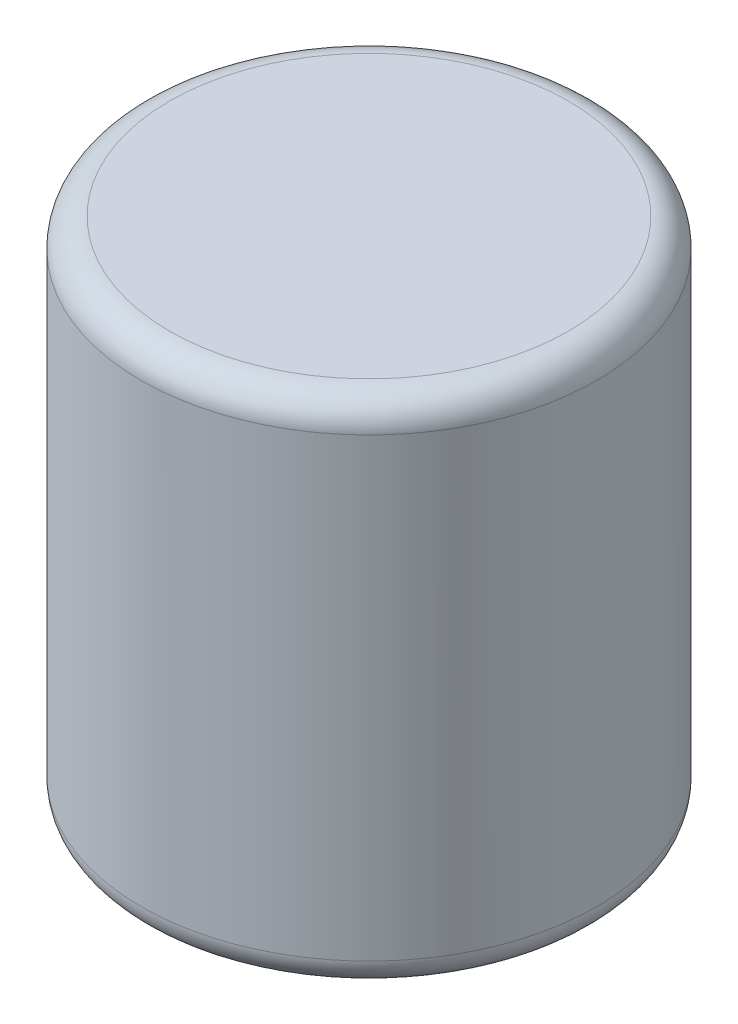
ISO-10303-21;
HEADER;
FILE_DESCRIPTION(('STEP AP214'),'2;1');
FILE_NAME('part.step','',(''),(''),'','','');
FILE_SCHEMA(('AUTOMOTIVE_DESIGN { 1 0 10303 214 1 1 1 1 }'));
ENDSEC;
DATA;
#1=APPLICATION_CONTEXT('core data for automotive mechanical design processes');
#2=APPLICATION_PROTOCOL_DEFINITION('international standard','automotive_design',2000,#1);
#3=PRODUCT_CONTEXT('',#1,'mechanical');
#4=PRODUCT('Part','Part','',(#3));
#5=PRODUCT_RELATED_PRODUCT_CATEGORY('part','',(#4));
#6=PRODUCT_DEFINITION_FORMATION('','',#4);
#7=PRODUCT_DEFINITION_CONTEXT('part definition',#1,'design');
#8=PRODUCT_DEFINITION('design','',#6,#7);
#9=PRODUCT_DEFINITION_SHAPE('','',#8);
#10=(LENGTH_UNIT() NAMED_UNIT(*) SI_UNIT(.MILLI.,.METRE.));
#11=(NAMED_UNIT(*) PLANE_ANGLE_UNIT() SI_UNIT($,.RADIAN.));
#12=(NAMED_UNIT(*) SI_UNIT($,.STERADIAN.) SOLID_ANGLE_UNIT());
#13=UNCERTAINTY_MEASURE_WITH_UNIT(LENGTH_MEASURE(1.E-05),#10,'distance_accuracy_value','');
#14=(GEOMETRIC_REPRESENTATION_CONTEXT(3) GLOBAL_UNCERTAINTY_ASSIGNED_CONTEXT((#13)) GLOBAL_UNIT_ASSIGNED_CONTEXT((#10,
#11,#12)) REPRESENTATION_CONTEXT('',''));
#15=CARTESIAN_POINT('',(0.,0.,0.));
#16=DIRECTION('',(0.,0.,1.));
#17=DIRECTION('',(1.,0.,0.));
#18=AXIS2_PLACEMENT_3D('',#15,#16,#17);
#19=CARTESIAN_POINT('',(0.,18.,0.));
#20=DIRECTION('',(0.,1.,0.));
#21=DIRECTION('',(0.,0.,1.));
#22=AXIS2_PLACEMENT_3D('',#19,#20,#21);
#23=PLANE('',#22);
#24=CARTESIAN_POINT('',(0.,18.,0.));
#25=DIRECTION('',(0.,1.,0.));
#26=DIRECTION('',(0.,0.,1.));
#27=AXIS2_PLACEMENT_3D('',#24,#25,#26);
#28=CIRCLE('',#27,7.);
#29=CARTESIAN_POINT('',(0.,18.,7.));
#30=VERTEX_POINT('',#29);
#31=EDGE_CURVE('E10',#30,#30,#28,.T.);
#32=ORIENTED_EDGE('',*,*,#31,.T.);
#33=EDGE_LOOP('',(#32));
#34=FACE_BOUND('',#33,.T.);
#35=ADVANCED_FACE('F39',(#34),#23,.T.);
#36=CARTESIAN_POINT('',(0.,0.,0.));
#37=DIRECTION('',(0.,-1.,0.));
#38=DIRECTION('',(0.,0.,-1.));
#39=AXIS2_PLACEMENT_3D('',#36,#37,#38);
#40=CYLINDRICAL_SURFACE('',#39,8.);
#41=CARTESIAN_POINT('',(0.,1.,0.));
#42=DIRECTION('',(0.,-1.,0.));
#43=DIRECTION('',(0.,0.,-1.));
#44=AXIS2_PLACEMENT_3D('',#41,#42,#43);
#45=CIRCLE('',#44,8.);
#46=CARTESIAN_POINT('',(0.,1.,-8.));
#47=VERTEX_POINT('',#46);
#48=EDGE_CURVE('E47',#47,#47,#45,.F.);
#49=ORIENTED_EDGE('',*,*,#48,.T.);
#50=EDGE_LOOP('',(#49));
#51=FACE_BOUND('',#50,.T.);
#52=CARTESIAN_POINT('',(0.,17.,0.));
#53=DIRECTION('',(0.,1.,0.));
#54=DIRECTION('',(0.,0.,1.));
#55=AXIS2_PLACEMENT_3D('',#52,#53,#54);
#56=CIRCLE('',#55,8.);
#57=CARTESIAN_POINT('',(0.,17.,8.));
#58=VERTEX_POINT('',#57);
#59=EDGE_CURVE('E52',#58,#58,#56,.F.);
#60=ORIENTED_EDGE('',*,*,#59,.T.);
#61=EDGE_LOOP('',(#60));
#62=FACE_BOUND('',#61,.T.);
#63=ADVANCED_FACE('F113',(#51,#62),#40,.T.);
#64=CARTESIAN_POINT('',(8.,0.,0.));
#65=DIRECTION('',(0.,-1.,0.));
#66=DIRECTION('',(0.,0.,-1.));
#67=AXIS2_PLACEMENT_3D('',#64,#65,#66);
#68=PLANE('',#67);
#69=CARTESIAN_POINT('',(0.,0.,0.));
#70=DIRECTION('',(0.,-1.,0.));
#71=DIRECTION('',(0.,0.,-1.));
#72=AXIS2_PLACEMENT_3D('',#69,#70,#71);
#73=CIRCLE('',#72,7.);
#74=CARTESIAN_POINT('',(0.,0.,-7.));
#75=VERTEX_POINT('',#74);
#76=EDGE_CURVE('E57',#75,#75,#73,.T.);
#77=ORIENTED_EDGE('',*,*,#76,.T.);
#78=EDGE_LOOP('',(#77));
#79=FACE_BOUND('',#78,.T.);
#80=CARTESIAN_POINT('',(0.,0.,0.));
#81=DIRECTION('',(0.,-1.,0.));
#82=DIRECTION('',(0.,0.,-1.));
#83=AXIS2_PLACEMENT_3D('',#80,#81,#82);
#84=CIRCLE('',#83,6.2);
#85=CARTESIAN_POINT('',(0.,0.,-6.2));
#86=VERTEX_POINT('',#85);
#87=EDGE_CURVE('E63',#86,#86,#84,.T.);
#88=ORIENTED_EDGE('',*,*,#87,.F.);
#89=EDGE_LOOP('',(#88));
#90=FACE_BOUND('',#89,.T.);
#91=ADVANCED_FACE('F118',(#79,#90),#68,.T.);
#92=CARTESIAN_POINT('',(0.,0.,0.));
#93=DIRECTION('',(0.,-1.,0.));
#94=DIRECTION('',(0.,0.,-1.));
#95=AXIS2_PLACEMENT_3D('',#92,#93,#94);
#96=CYLINDRICAL_SURFACE('',#95,6.2);
#97=ORIENTED_EDGE('',*,*,#87,.T.);
#98=EDGE_LOOP('',(#97));
#99=FACE_BOUND('',#98,.T.);
#100=CARTESIAN_POINT('',(0.,0.75,0.));
#101=DIRECTION('',(0.,-1.,0.));
#102=DIRECTION('',(0.,0.,-1.));
#103=AXIS2_PLACEMENT_3D('',#100,#101,#102);
#104=CIRCLE('',#103,6.2);
#105=CARTESIAN_POINT('',(0.,0.75,-6.2));
#106=VERTEX_POINT('',#105);
#107=EDGE_CURVE('E67',#106,#106,#104,.T.);
#108=ORIENTED_EDGE('',*,*,#107,.F.);
#109=EDGE_LOOP('',(#108));
#110=FACE_BOUND('',#109,.T.);
#111=ADVANCED_FACE('F132',(#99,#110),#96,.F.);
#112=CARTESIAN_POINT('',(6.2,0.75,0.));
#113=DIRECTION('',(0.,1.,0.));
#114=DIRECTION('',(0.,0.,1.));
#115=AXIS2_PLACEMENT_3D('',#112,#113,#114);
#116=PLANE('',#115);
#117=ORIENTED_EDGE('',*,*,#107,.T.);
#118=EDGE_LOOP('',(#117));
#119=FACE_BOUND('',#118,.T.);
#120=CARTESIAN_POINT('',(0.,0.75,0.));
#121=DIRECTION('',(0.,-1.,0.));
#122=DIRECTION('',(0.,0.,-1.));
#123=AXIS2_PLACEMENT_3D('',#120,#121,#122);
#124=CIRCLE('',#123,6.5);
#125=CARTESIAN_POINT('',(0.,0.75,-6.5));
#126=VERTEX_POINT('',#125);
#127=EDGE_CURVE('E71',#126,#126,#124,.T.);
#128=ORIENTED_EDGE('',*,*,#127,.F.);
#129=EDGE_LOOP('',(#128));
#130=FACE_BOUND('',#129,.T.);
#131=ADVANCED_FACE('F137',(#119,#130),#116,.T.);
#132=CARTESIAN_POINT('',(0.,0.,0.));
#133=DIRECTION('',(0.,-1.,0.));
#134=DIRECTION('',(0.,0.,-1.));
#135=AXIS2_PLACEMENT_3D('',#132,#133,#134);
#136=CYLINDRICAL_SURFACE('',#135,6.5);
#137=ORIENTED_EDGE('',*,*,#127,.T.);
#138=EDGE_LOOP('',(#137));
#139=FACE_BOUND('',#138,.T.);
#140=CARTESIAN_POINT('',(0.,14.5,0.));
#141=DIRECTION('',(0.,-1.,0.));
#142=DIRECTION('',(0.,0.,-1.));
#143=AXIS2_PLACEMENT_3D('',#140,#141,#142);
#144=CIRCLE('',#143,6.5);
#145=CARTESIAN_POINT('',(0.,14.5,-6.5));
#146=VERTEX_POINT('',#145);
#147=EDGE_CURVE('E75',#146,#146,#144,.T.);
#148=ORIENTED_EDGE('',*,*,#147,.F.);
#149=EDGE_LOOP('',(#148));
#150=FACE_BOUND('',#149,.T.);
#151=ADVANCED_FACE('F143',(#139,#150),#136,.F.);
#152=CARTESIAN_POINT('',(6.5,14.5,0.));
#153=DIRECTION('',(0.,-1.,0.));
#154=DIRECTION('',(0.,0.,-1.));
#155=AXIS2_PLACEMENT_3D('',#152,#153,#154);
#156=PLANE('',#155);
#157=ORIENTED_EDGE('',*,*,#147,.T.);
#158=EDGE_LOOP('',(#157));
#159=FACE_BOUND('',#158,.T.);
#160=CARTESIAN_POINT('',(0.,14.5,0.));
#161=DIRECTION('',(0.,-1.,0.));
#162=DIRECTION('',(0.,0.,-1.));
#163=AXIS2_PLACEMENT_3D('',#160,#161,#162);
#164=CIRCLE('',#163,6.2);
#165=CARTESIAN_POINT('',(0.,14.5,-6.2));
#166=VERTEX_POINT('',#165);
#167=EDGE_CURVE('E79',#166,#166,#164,.T.);
#168=ORIENTED_EDGE('',*,*,#167,.F.);
#169=EDGE_LOOP('',(#168));
#170=FACE_BOUND('',#169,.T.);
#171=ADVANCED_FACE('F149',(#159,#170),#156,.T.);
#172=CARTESIAN_POINT('',(0.,0.,0.));
#173=DIRECTION('',(0.,-1.,0.));
#174=DIRECTION('',(0.,0.,-1.));
#175=AXIS2_PLACEMENT_3D('',#172,#173,#174);
#176=CYLINDRICAL_SURFACE('',#175,6.2);
#177=ORIENTED_EDGE('',*,*,#167,.T.);
#178=EDGE_LOOP('',(#177));
#179=FACE_BOUND('',#178,.T.);
#180=CARTESIAN_POINT('',(0.,15.25,0.));
#181=DIRECTION('',(0.,-1.,0.));
#182=DIRECTION('',(0.,0.,-1.));
#183=AXIS2_PLACEMENT_3D('',#180,#181,#182);
#184=CIRCLE('',#183,6.2);
#185=CARTESIAN_POINT('',(0.,15.25,-6.2));
#186=VERTEX_POINT('',#185);
#187=EDGE_CURVE('E83',#186,#186,#184,.T.);
#188=ORIENTED_EDGE('',*,*,#187,.F.);
#189=EDGE_LOOP('',(#188));
#190=FACE_BOUND('',#189,.T.);
#191=ADVANCED_FACE('F109',(#179,#190),#176,.F.);
#192=CARTESIAN_POINT('',(6.2,15.25,0.));
#193=DIRECTION('',(0.,-1.,0.));
#194=DIRECTION('',(0.,0.,-1.));
#195=AXIS2_PLACEMENT_3D('',#192,#193,#194);
#196=PLANE('',#195);
#197=ORIENTED_EDGE('',*,*,#187,.T.);
#198=EDGE_LOOP('',(#197));
#199=FACE_BOUND('',#198,.T.);
#200=CARTESIAN_POINT('',(0.,15.25,0.));
#201=DIRECTION('',(0.,-1.,0.));
#202=DIRECTION('',(0.,0.,-1.));
#203=AXIS2_PLACEMENT_3D('',#200,#201,#202);
#204=CIRCLE('',#203,5.5);
#205=CARTESIAN_POINT('',(0.,15.25,-5.5));
#206=VERTEX_POINT('',#205);
#207=EDGE_CURVE('E87',#206,#206,#204,.T.);
#208=ORIENTED_EDGE('',*,*,#207,.F.);
#209=EDGE_LOOP('',(#208));
#210=FACE_BOUND('',#209,.T.);
#211=ADVANCED_FACE('F100',(#199,#210),#196,.T.);
#212=CARTESIAN_POINT('',(0.,0.,0.));
#213=DIRECTION('',(0.,-1.,0.));
#214=DIRECTION('',(0.,0.,-1.));
#215=AXIS2_PLACEMENT_3D('',#212,#213,#214);
#216=CYLINDRICAL_SURFACE('',#215,5.5);
#217=ORIENTED_EDGE('',*,*,#207,.T.);
#218=EDGE_LOOP('',(#217));
#219=FACE_BOUND('',#218,.T.);
#220=CARTESIAN_POINT('',(0.,16.5,0.));
#221=DIRECTION('',(0.,-1.,0.));
#222=DIRECTION('',(0.,0.,-1.));
#223=AXIS2_PLACEMENT_3D('',#220,#221,#222);
#224=CIRCLE('',#223,5.5);
#225=CARTESIAN_POINT('',(0.,16.5,-5.5));
#226=VERTEX_POINT('',#225);
#227=EDGE_CURVE('E91',#226,#226,#224,.T.);
#228=ORIENTED_EDGE('',*,*,#227,.F.);
#229=EDGE_LOOP('',(#228));
#230=FACE_BOUND('',#229,.T.);
#231=ADVANCED_FACE('F98',(#219,#230),#216,.F.);
#232=CARTESIAN_POINT('',(5.5,16.5,0.));
#233=DIRECTION('',(0.,-1.,0.));
#234=DIRECTION('',(0.,0.,-1.));
#235=AXIS2_PLACEMENT_3D('',#232,#233,#234);
#236=PLANE('',#235);
#237=ORIENTED_EDGE('',*,*,#227,.T.);
#238=EDGE_LOOP('',(#237));
#239=FACE_BOUND('',#238,.T.);
#240=ADVANCED_FACE('F96',(#239),#236,.T.);
#241=CARTESIAN_POINT('',(0.,1.,0.));
#242=DIRECTION('',(0.,-1.,0.));
#243=DIRECTION('',(0.,0.,-1.));
#244=AXIS2_PLACEMENT_3D('',#241,#242,#243);
#245=TOROIDAL_SURFACE('',#244,7.,1.);
#246=ORIENTED_EDGE('',*,*,#48,.F.);
#247=EDGE_LOOP('',(#246));
#248=FACE_BOUND('',#247,.T.);
#249=ORIENTED_EDGE('',*,*,#76,.F.);
#250=EDGE_LOOP('',(#249));
#251=FACE_BOUND('',#250,.T.);
#252=ADVANCED_FACE('F107',(#248,#251),#245,.T.);
#253=CARTESIAN_POINT('',(0.,17.,0.));
#254=DIRECTION('',(0.,1.,0.));
#255=DIRECTION('',(0.,0.,1.));
#256=AXIS2_PLACEMENT_3D('',#253,#254,#255);
#257=TOROIDAL_SURFACE('',#256,7.,1.);
#258=ORIENTED_EDGE('',*,*,#31,.F.);
#259=EDGE_LOOP('',(#258));
#260=FACE_BOUND('',#259,.T.);
#261=ORIENTED_EDGE('',*,*,#59,.F.);
#262=EDGE_LOOP('',(#261));
#263=FACE_BOUND('',#262,.T.);
#264=ADVANCED_FACE('F41',(#260,#263),#257,.T.);
#265=CLOSED_SHELL('',(#35,#63,#91,#111,#131,#151,#171,#191,#211,#231,#240,#252,#264));
#266=MANIFOLD_SOLID_BREP('B2',#265);
#267=ADVANCED_BREP_SHAPE_REPRESENTATION('',(#18,#266),#14);
#268=SHAPE_DEFINITION_REPRESENTATION(#9,#267);
ENDSEC;
END-ISO-10303-21;
